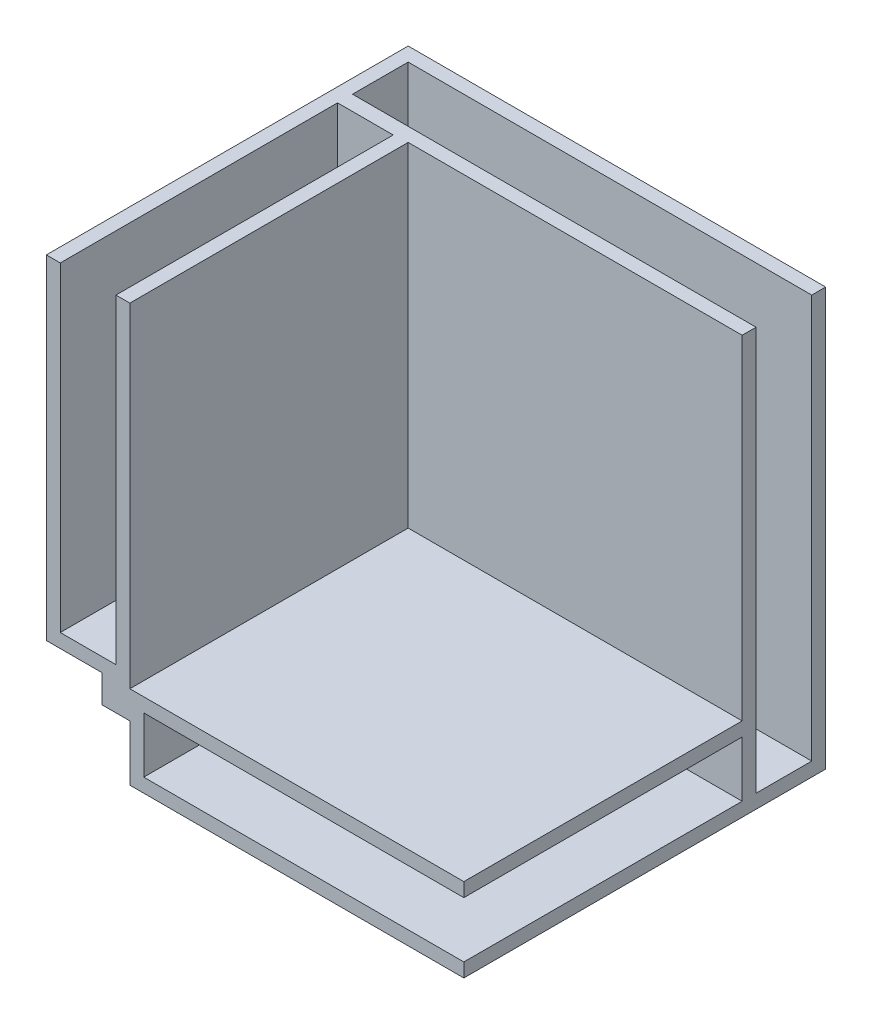
ISO-10303-21;
HEADER;
FILE_DESCRIPTION(('STEP AP214'),'2;1');
FILE_NAME('part.step','',(''),(''),'','','');
FILE_SCHEMA(('AUTOMOTIVE_DESIGN { 1 0 10303 214 1 1 1 1 }'));
ENDSEC;
DATA;
#1=APPLICATION_CONTEXT('core data for automotive mechanical design processes');
#2=APPLICATION_PROTOCOL_DEFINITION('international standard','automotive_design',2000,#1);
#3=PRODUCT_CONTEXT('',#1,'mechanical');
#4=PRODUCT('Part','Part','',(#3));
#5=PRODUCT_RELATED_PRODUCT_CATEGORY('part','',(#4));
#6=PRODUCT_DEFINITION_FORMATION('','',#4);
#7=PRODUCT_DEFINITION_CONTEXT('part definition',#1,'design');
#8=PRODUCT_DEFINITION('design','',#6,#7);
#9=PRODUCT_DEFINITION_SHAPE('','',#8);
#10=(LENGTH_UNIT() NAMED_UNIT(*) SI_UNIT(.MILLI.,.METRE.));
#11=(NAMED_UNIT(*) PLANE_ANGLE_UNIT() SI_UNIT($,.RADIAN.));
#12=(NAMED_UNIT(*) SI_UNIT($,.STERADIAN.) SOLID_ANGLE_UNIT());
#13=UNCERTAINTY_MEASURE_WITH_UNIT(LENGTH_MEASURE(1.E-05),#10,'distance_accuracy_value','');
#14=(GEOMETRIC_REPRESENTATION_CONTEXT(3) GLOBAL_UNCERTAINTY_ASSIGNED_CONTEXT((#13)) GLOBAL_UNIT_ASSIGNED_CONTEXT((#10,
#11,#12)) REPRESENTATION_CONTEXT('',''));
#15=CARTESIAN_POINT('',(0.,0.,0.));
#16=DIRECTION('',(0.,0.,1.));
#17=DIRECTION('',(1.,0.,0.));
#18=AXIS2_PLACEMENT_3D('',#15,#16,#17);
#19=CARTESIAN_POINT('',(5.,0.,26.));
#20=DIRECTION('',(-1.,0.,0.));
#21=DIRECTION('',(0.,0.,1.));
#22=AXIS2_PLACEMENT_3D('',#19,#20,#21);
#23=PLANE('',#22);
#24=DIRECTION('',(0.,1.,0.));
#25=VECTOR('',#24,1.);
#26=CARTESIAN_POINT('',(5.,30.,6.07514362919426));
#27=LINE('',#26,#25);
#28=CARTESIAN_POINT('',(5.,7.,6.07514362919426));
#29=VERTEX_POINT('',#28);
#30=CARTESIAN_POINT('',(5.,30.,6.07514362919426));
#31=VERTEX_POINT('',#30);
#32=EDGE_CURVE('E237',#29,#31,#27,.T.);
#33=ORIENTED_EDGE('',*,*,#32,.F.);
#34=DIRECTION('',(0.,0.,-1.));
#35=VECTOR('',#34,1.);
#36=CARTESIAN_POINT('',(5.,7.,26.));
#37=LINE('',#36,#35);
#38=CARTESIAN_POINT('',(5.,7.,26.));
#39=VERTEX_POINT('',#38);
#40=EDGE_CURVE('E260',#39,#29,#37,.T.);
#41=ORIENTED_EDGE('',*,*,#40,.F.);
#42=DIRECTION('',(0.,1.,0.));
#43=VECTOR('',#42,1.);
#44=CARTESIAN_POINT('',(5.,7.,26.));
#45=LINE('',#44,#43);
#46=CARTESIAN_POINT('',(5.,30.,26.));
#47=VERTEX_POINT('',#46);
#48=EDGE_CURVE('E234',#39,#47,#45,.T.);
#49=ORIENTED_EDGE('',*,*,#48,.T.);
#50=DIRECTION('',(0.,0.,-1.));
#51=VECTOR('',#50,1.);
#52=CARTESIAN_POINT('',(5.,30.,6.));
#53=LINE('',#52,#51);
#54=EDGE_CURVE('E264',#47,#31,#53,.T.);
#55=ORIENTED_EDGE('',*,*,#54,.T.);
#56=EDGE_LOOP('',(#33,#41,#49,#55));
#57=FACE_BOUND('',#56,.T.);
#58=ADVANCED_FACE('F37',(#57),#23,.T.);
#59=CARTESIAN_POINT('',(0.,7.,26.));
#60=DIRECTION('',(0.,-1.,0.));
#61=DIRECTION('',(1.,0.,0.));
#62=AXIS2_PLACEMENT_3D('',#59,#60,#61);
#63=PLANE('',#62);
#64=DIRECTION('',(1.,0.,0.));
#65=VECTOR('',#64,1.);
#66=CARTESIAN_POINT('',(0.,7.,6.07514362919426));
#67=LINE('',#66,#65);
#68=CARTESIAN_POINT('',(1.,7.,6.07514362919426));
#69=VERTEX_POINT('',#68);
#70=EDGE_CURVE('E243',#69,#29,#67,.T.);
#71=ORIENTED_EDGE('',*,*,#70,.F.);
#72=DIRECTION('',(0.,0.,-1.));
#73=VECTOR('',#72,1.);
#74=CARTESIAN_POINT('',(1.,7.,6.));
#75=LINE('',#74,#73);
#76=CARTESIAN_POINT('',(1.,7.,26.));
#77=VERTEX_POINT('',#76);
#78=EDGE_CURVE('E262',#77,#69,#75,.T.);
#79=ORIENTED_EDGE('',*,*,#78,.F.);
#80=DIRECTION('',(1.,0.,0.));
#81=VECTOR('',#80,1.);
#82=CARTESIAN_POINT('',(1.,7.,26.));
#83=LINE('',#82,#81);
#84=EDGE_CURVE('E231',#77,#39,#83,.T.);
#85=ORIENTED_EDGE('',*,*,#84,.T.);
#86=ORIENTED_EDGE('',*,*,#40,.T.);
#87=EDGE_LOOP('',(#71,#79,#85,#86));
#88=FACE_BOUND('',#87,.T.);
#89=ADVANCED_FACE('F412',(#88),#63,.F.);
#90=CARTESIAN_POINT('',(1.,0.,6.));
#91=DIRECTION('',(1.,0.,0.));
#92=DIRECTION('',(0.,0.,-1.));
#93=AXIS2_PLACEMENT_3D('',#90,#91,#92);
#94=PLANE('',#93);
#95=DIRECTION('',(0.,0.,-1.));
#96=VECTOR('',#95,1.);
#97=CARTESIAN_POINT('',(1.,30.,6.));
#98=LINE('',#97,#96);
#99=CARTESIAN_POINT('',(1.,30.,5.));
#100=VERTEX_POINT('',#99);
#101=CARTESIAN_POINT('',(1.,30.,1.));
#102=VERTEX_POINT('',#101);
#103=EDGE_CURVE('E281',#100,#102,#98,.T.);
#104=ORIENTED_EDGE('',*,*,#103,.F.);
#105=DIRECTION('',(0.,-1.,0.));
#106=VECTOR('',#105,1.);
#107=CARTESIAN_POINT('',(1.,0.,5.));
#108=LINE('',#107,#106);
#109=CARTESIAN_POINT('',(1.,1.,5.));
#110=VERTEX_POINT('',#109);
#111=EDGE_CURVE('E253',#100,#110,#108,.T.);
#112=ORIENTED_EDGE('',*,*,#111,.T.);
#113=DIRECTION('',(0.,0.,-1.));
#114=VECTOR('',#113,1.);
#115=CARTESIAN_POINT('',(1.,1.,6.));
#116=LINE('',#115,#114);
#117=CARTESIAN_POINT('',(1.,1.,1.));
#118=VERTEX_POINT('',#117);
#119=EDGE_CURVE('E269',#110,#118,#116,.T.);
#120=ORIENTED_EDGE('',*,*,#119,.T.);
#121=DIRECTION('',(0.,-1.,0.));
#122=VECTOR('',#121,1.);
#123=CARTESIAN_POINT('',(1.,0.,1.));
#124=LINE('',#123,#122);
#125=EDGE_CURVE('E265',#102,#118,#124,.T.);
#126=ORIENTED_EDGE('',*,*,#125,.F.);
#127=EDGE_LOOP('',(#104,#112,#120,#126));
#128=FACE_BOUND('',#127,.T.);
#129=ADVANCED_FACE('F431',(#128),#94,.T.);
#130=DIRECTION('',(0.,1.,0.));
#131=VECTOR('',#130,1.);
#132=CARTESIAN_POINT('',(1.,0.,6.07514362919426));
#133=LINE('',#132,#131);
#134=CARTESIAN_POINT('',(1.,30.,6.07514362919426));
#135=VERTEX_POINT('',#134);
#136=EDGE_CURVE('E11',#69,#135,#133,.T.);
#137=ORIENTED_EDGE('',*,*,#136,.T.);
#138=CARTESIAN_POINT('',(1.,30.,26.));
#139=VERTEX_POINT('',#138);
#140=EDGE_CURVE('E278',#139,#135,#98,.T.);
#141=ORIENTED_EDGE('',*,*,#140,.F.);
#142=DIRECTION('',(0.,-1.,0.));
#143=VECTOR('',#142,1.);
#144=CARTESIAN_POINT('',(1.,7.,26.));
#145=LINE('',#144,#143);
#146=EDGE_CURVE('E226',#139,#77,#145,.T.);
#147=ORIENTED_EDGE('',*,*,#146,.T.);
#148=ORIENTED_EDGE('',*,*,#78,.T.);
#149=EDGE_LOOP('',(#137,#141,#147,#148));
#150=FACE_BOUND('',#149,.T.);
#151=ADVANCED_FACE('F415',(#150),#94,.T.);
#152=CARTESIAN_POINT('',(6.,5.,26.));
#153=DIRECTION('',(0.,-1.,0.));
#154=DIRECTION('',(0.,0.,-1.));
#155=AXIS2_PLACEMENT_3D('',#152,#153,#154);
#156=PLANE('',#155);
#157=DIRECTION('',(0.,0.,-1.));
#158=VECTOR('',#157,1.);
#159=CARTESIAN_POINT('',(7.,5.,26.));
#160=LINE('',#159,#158);
#161=CARTESIAN_POINT('',(7.,5.,26.));
#162=VERTEX_POINT('',#161);
#163=CARTESIAN_POINT('',(7.,5.,6.));
#164=VERTEX_POINT('',#163);
#165=EDGE_CURVE('E210',#162,#164,#160,.T.);
#166=ORIENTED_EDGE('',*,*,#165,.T.);
#167=DIRECTION('',(-1.,0.,0.));
#168=VECTOR('',#167,1.);
#169=CARTESIAN_POINT('',(30.,5.,6.));
#170=LINE('',#169,#168);
#171=CARTESIAN_POINT('',(30.,5.,6.));
#172=VERTEX_POINT('',#171);
#173=EDGE_CURVE('E246',#172,#164,#170,.T.);
#174=ORIENTED_EDGE('',*,*,#173,.F.);
#175=DIRECTION('',(0.,0.,-1.));
#176=VECTOR('',#175,1.);
#177=CARTESIAN_POINT('',(30.,5.,26.));
#178=LINE('',#177,#176);
#179=CARTESIAN_POINT('',(30.,5.,26.));
#180=VERTEX_POINT('',#179);
#181=EDGE_CURVE('E211',#180,#172,#178,.T.);
#182=ORIENTED_EDGE('',*,*,#181,.F.);
#183=DIRECTION('',(-1.,0.,0.));
#184=VECTOR('',#183,1.);
#185=CARTESIAN_POINT('',(7.,5.,26.));
#186=LINE('',#185,#184);
#187=EDGE_CURVE('E224',#180,#162,#186,.T.);
#188=ORIENTED_EDGE('',*,*,#187,.T.);
#189=EDGE_LOOP('',(#166,#174,#182,#188));
#190=FACE_BOUND('',#189,.T.);
#191=ADVANCED_FACE('F385',(#190),#156,.T.);
#192=CARTESIAN_POINT('',(0.,1.,6.));
#193=DIRECTION('',(0.,1.,0.));
#194=DIRECTION('',(0.,0.,1.));
#195=AXIS2_PLACEMENT_3D('',#192,#193,#194);
#196=PLANE('',#195);
#197=DIRECTION('',(0.,0.,-1.));
#198=VECTOR('',#197,1.);
#199=CARTESIAN_POINT('',(30.,1.,6.));
#200=LINE('',#199,#198);
#201=CARTESIAN_POINT('',(30.,1.,26.));
#202=VERTEX_POINT('',#201);
#203=CARTESIAN_POINT('',(30.,1.,6.));
#204=VERTEX_POINT('',#203);
#205=EDGE_CURVE('E273',#202,#204,#200,.T.);
#206=ORIENTED_EDGE('',*,*,#205,.T.);
#207=DIRECTION('',(-1.,0.,0.));
#208=VECTOR('',#207,1.);
#209=CARTESIAN_POINT('',(0.,1.,6.));
#210=LINE('',#209,#208);
#211=CARTESIAN_POINT('',(7.,1.,6.));
#212=VERTEX_POINT('',#211);
#213=EDGE_CURVE('E206',#204,#212,#210,.T.);
#214=ORIENTED_EDGE('',*,*,#213,.T.);
#215=DIRECTION('',(0.,0.,-1.));
#216=VECTOR('',#215,1.);
#217=CARTESIAN_POINT('',(7.,1.,6.));
#218=LINE('',#217,#216);
#219=CARTESIAN_POINT('',(7.,1.,26.));
#220=VERTEX_POINT('',#219);
#221=EDGE_CURVE('E199',#220,#212,#218,.T.);
#222=ORIENTED_EDGE('',*,*,#221,.F.);
#223=DIRECTION('',(1.,0.,0.));
#224=VECTOR('',#223,1.);
#225=CARTESIAN_POINT('',(7.,1.,26.));
#226=LINE('',#225,#224);
#227=EDGE_CURVE('E203',#220,#202,#226,.T.);
#228=ORIENTED_EDGE('',*,*,#227,.T.);
#229=EDGE_LOOP('',(#206,#214,#222,#228));
#230=FACE_BOUND('',#229,.T.);
#231=ADVANCED_FACE('F201',(#230),#196,.T.);
#232=DIRECTION('',(1.,0.,0.));
#233=VECTOR('',#232,1.);
#234=CARTESIAN_POINT('',(0.,1.,5.));
#235=LINE('',#234,#233);
#236=CARTESIAN_POINT('',(30.,1.,5.));
#237=VERTEX_POINT('',#236);
#238=EDGE_CURVE('E255',#110,#237,#235,.T.);
#239=ORIENTED_EDGE('',*,*,#238,.T.);
#240=CARTESIAN_POINT('',(30.,1.,1.));
#241=VERTEX_POINT('',#240);
#242=EDGE_CURVE('E280',#237,#241,#200,.T.);
#243=ORIENTED_EDGE('',*,*,#242,.T.);
#244=DIRECTION('',(1.,0.,0.));
#245=VECTOR('',#244,1.);
#246=CARTESIAN_POINT('',(0.,1.,1.));
#247=LINE('',#246,#245);
#248=EDGE_CURVE('E268',#118,#241,#247,.T.);
#249=ORIENTED_EDGE('',*,*,#248,.F.);
#250=ORIENTED_EDGE('',*,*,#119,.F.);
#251=EDGE_LOOP('',(#239,#243,#249,#250));
#252=FACE_BOUND('',#251,.T.);
#253=ADVANCED_FACE('F441',(#252),#196,.T.);
#254=CARTESIAN_POINT('',(7.,6.,26.));
#255=DIRECTION('',(1.,0.,0.));
#256=DIRECTION('',(0.,1.,0.));
#257=AXIS2_PLACEMENT_3D('',#254,#255,#256);
#258=PLANE('',#257);
#259=ORIENTED_EDGE('',*,*,#221,.T.);
#260=DIRECTION('',(0.,1.,0.));
#261=VECTOR('',#260,1.);
#262=CARTESIAN_POINT('',(7.,6.,6.));
#263=LINE('',#262,#261);
#264=EDGE_CURVE('E45',#212,#164,#263,.T.);
#265=ORIENTED_EDGE('',*,*,#264,.T.);
#266=ORIENTED_EDGE('',*,*,#165,.F.);
#267=DIRECTION('',(0.,-1.,0.));
#268=VECTOR('',#267,1.);
#269=CARTESIAN_POINT('',(7.,5.,26.));
#270=LINE('',#269,#268);
#271=EDGE_CURVE('E214',#162,#220,#270,.T.);
#272=ORIENTED_EDGE('',*,*,#271,.T.);
#273=EDGE_LOOP('',(#259,#265,#266,#272));
#274=FACE_BOUND('',#273,.T.);
#275=ADVANCED_FACE('F215',(#274),#258,.T.);
#276=CARTESIAN_POINT('',(30.,0.,6.));
#277=DIRECTION('',(-1.,0.,0.));
#278=DIRECTION('',(0.,0.,1.));
#279=AXIS2_PLACEMENT_3D('',#276,#277,#278);
#280=PLANE('',#279);
#281=DIRECTION('',(0.,1.,0.));
#282=VECTOR('',#281,1.);
#283=CARTESIAN_POINT('',(30.,6.,26.));
#284=LINE('',#283,#282);
#285=CARTESIAN_POINT('',(30.,6.,26.));
#286=VERTEX_POINT('',#285);
#287=EDGE_CURVE('E296',#180,#286,#284,.T.);
#288=ORIENTED_EDGE('',*,*,#287,.F.);
#289=ORIENTED_EDGE('',*,*,#181,.T.);
#290=DIRECTION('',(0.,1.,0.));
#291=VECTOR('',#290,1.);
#292=CARTESIAN_POINT('',(30.,0.,6.));
#293=LINE('',#292,#291);
#294=EDGE_CURVE('E249',#204,#172,#293,.T.);
#295=ORIENTED_EDGE('',*,*,#294,.F.);
#296=ORIENTED_EDGE('',*,*,#205,.F.);
#297=CARTESIAN_POINT('',(30.,0.,26.));
#298=VERTEX_POINT('',#297);
#299=EDGE_CURVE('E223',#298,#202,#284,.T.);
#300=ORIENTED_EDGE('',*,*,#299,.F.);
#301=DIRECTION('',(0.,0.,-1.));
#302=VECTOR('',#301,1.);
#303=CARTESIAN_POINT('',(30.,0.,6.));
#304=LINE('',#303,#302);
#305=CARTESIAN_POINT('',(30.,0.,0.));
#306=VERTEX_POINT('',#305);
#307=EDGE_CURVE('E376',#298,#306,#304,.T.);
#308=ORIENTED_EDGE('',*,*,#307,.T.);
#309=DIRECTION('',(0.,1.,0.));
#310=VECTOR('',#309,1.);
#311=CARTESIAN_POINT('',(30.,0.,0.));
#312=LINE('',#311,#310);
#313=CARTESIAN_POINT('',(30.,30.,0.));
#314=VERTEX_POINT('',#313);
#315=EDGE_CURVE('E367',#306,#314,#312,.T.);
#316=ORIENTED_EDGE('',*,*,#315,.T.);
#317=DIRECTION('',(0.,0.,-1.));
#318=VECTOR('',#317,1.);
#319=CARTESIAN_POINT('',(30.,30.,6.));
#320=LINE('',#319,#318);
#321=CARTESIAN_POINT('',(30.,30.,1.));
#322=VERTEX_POINT('',#321);
#323=EDGE_CURVE('E373',#322,#314,#320,.T.);
#324=ORIENTED_EDGE('',*,*,#323,.F.);
#325=DIRECTION('',(0.,1.,0.));
#326=VECTOR('',#325,1.);
#327=CARTESIAN_POINT('',(30.,0.,1.));
#328=LINE('',#327,#326);
#329=EDGE_CURVE('E275',#241,#322,#328,.T.);
#330=ORIENTED_EDGE('',*,*,#329,.F.);
#331=ORIENTED_EDGE('',*,*,#242,.F.);
#332=DIRECTION('',(0.,1.,0.));
#333=VECTOR('',#332,1.);
#334=CARTESIAN_POINT('',(30.,0.,5.));
#335=LINE('',#334,#333);
#336=CARTESIAN_POINT('',(30.,30.,5.));
#337=VERTEX_POINT('',#336);
#338=EDGE_CURVE('E259',#237,#337,#335,.T.);
#339=ORIENTED_EDGE('',*,*,#338,.T.);
#340=CARTESIAN_POINT('',(30.,30.,6.));
#341=VERTEX_POINT('',#340);
#342=EDGE_CURVE('E374',#341,#337,#320,.T.);
#343=ORIENTED_EDGE('',*,*,#342,.F.);
#344=DIRECTION('',(0.,1.,0.));
#345=VECTOR('',#344,1.);
#346=CARTESIAN_POINT('',(30.,0.,6.));
#347=LINE('',#346,#345);
#348=CARTESIAN_POINT('',(30.,6.,6.));
#349=VERTEX_POINT('',#348);
#350=EDGE_CURVE('E356',#349,#341,#347,.T.);
#351=ORIENTED_EDGE('',*,*,#350,.F.);
#352=DIRECTION('',(0.,0.,-1.));
#353=VECTOR('',#352,1.);
#354=CARTESIAN_POINT('',(30.,6.,26.));
#355=LINE('',#354,#353);
#356=EDGE_CURVE('E306',#286,#349,#355,.T.);
#357=ORIENTED_EDGE('',*,*,#356,.F.);
#358=EDGE_LOOP('',(#288,#289,#295,#296,#300,#308,#316,#324,#330,#331,#339,#343,#351,#357));
#359=FACE_BOUND('',#358,.T.);
#360=ADVANCED_FACE('F389',(#359),#280,.F.);
#361=CARTESIAN_POINT('',(0.,30.,6.));
#362=DIRECTION('',(0.,-1.,0.));
#363=DIRECTION('',(0.,0.,-1.));
#364=AXIS2_PLACEMENT_3D('',#361,#362,#363);
#365=PLANE('',#364);
#366=DIRECTION('',(-1.,0.,0.));
#367=VECTOR('',#366,1.);
#368=CARTESIAN_POINT('',(0.,30.,26.));
#369=LINE('',#368,#367);
#370=CARTESIAN_POINT('',(0.,30.,26.));
#371=VERTEX_POINT('',#370);
#372=EDGE_CURVE('E336',#139,#371,#369,.T.);
#373=ORIENTED_EDGE('',*,*,#372,.F.);
#374=ORIENTED_EDGE('',*,*,#140,.T.);
#375=DIRECTION('',(1.,0.,0.));
#376=VECTOR('',#375,1.);
#377=CARTESIAN_POINT('',(0.,30.,6.07514362919426));
#378=LINE('',#377,#376);
#379=EDGE_CURVE('E240',#135,#31,#378,.T.);
#380=ORIENTED_EDGE('',*,*,#379,.T.);
#381=ORIENTED_EDGE('',*,*,#54,.F.);
#382=CARTESIAN_POINT('',(6.,30.,26.));
#383=VERTEX_POINT('',#382);
#384=EDGE_CURVE('E337',#383,#47,#369,.T.);
#385=ORIENTED_EDGE('',*,*,#384,.F.);
#386=DIRECTION('',(0.,0.,-1.));
#387=VECTOR('',#386,1.);
#388=CARTESIAN_POINT('',(6.,30.,26.));
#389=LINE('',#388,#387);
#390=CARTESIAN_POINT('',(6.,30.,6.));
#391=VERTEX_POINT('',#390);
#392=EDGE_CURVE('E348',#383,#391,#389,.T.);
#393=ORIENTED_EDGE('',*,*,#392,.T.);
#394=DIRECTION('',(-1.,0.,0.));
#395=VECTOR('',#394,1.);
#396=CARTESIAN_POINT('',(0.,30.,6.));
#397=LINE('',#396,#395);
#398=EDGE_CURVE('E358',#341,#391,#397,.T.);
#399=ORIENTED_EDGE('',*,*,#398,.F.);
#400=ORIENTED_EDGE('',*,*,#342,.T.);
#401=DIRECTION('',(-1.,0.,0.));
#402=VECTOR('',#401,1.);
#403=CARTESIAN_POINT('',(0.,30.,5.));
#404=LINE('',#403,#402);
#405=EDGE_CURVE('E52',#337,#100,#404,.T.);
#406=ORIENTED_EDGE('',*,*,#405,.T.);
#407=ORIENTED_EDGE('',*,*,#103,.T.);
#408=DIRECTION('',(-1.,0.,0.));
#409=VECTOR('',#408,1.);
#410=CARTESIAN_POINT('',(0.,30.,1.));
#411=LINE('',#410,#409);
#412=EDGE_CURVE('E256',#322,#102,#411,.T.);
#413=ORIENTED_EDGE('',*,*,#412,.F.);
#414=ORIENTED_EDGE('',*,*,#323,.T.);
#415=DIRECTION('',(-1.,0.,0.));
#416=VECTOR('',#415,1.);
#417=CARTESIAN_POINT('',(0.,30.,0.));
#418=LINE('',#417,#416);
#419=CARTESIAN_POINT('',(0.,30.,0.));
#420=VERTEX_POINT('',#419);
#421=EDGE_CURVE('E354',#314,#420,#418,.T.);
#422=ORIENTED_EDGE('',*,*,#421,.T.);
#423=DIRECTION('',(0.,0.,-1.));
#424=VECTOR('',#423,1.);
#425=CARTESIAN_POINT('',(0.,30.,6.));
#426=LINE('',#425,#424);
#427=EDGE_CURVE('E361',#371,#420,#426,.T.);
#428=ORIENTED_EDGE('',*,*,#427,.F.);
#429=EDGE_LOOP('',(#373,#374,#380,#381,#385,#393,#399,#400,#406,#407,#413,#414,#422,#428));
#430=FACE_BOUND('',#429,.T.);
#431=ADVANCED_FACE('F404',(#430),#365,.F.);
#432=CARTESIAN_POINT('',(0.,0.,6.));
#433=DIRECTION('',(0.,0.,-1.));
#434=DIRECTION('',(-1.,0.,0.));
#435=AXIS2_PLACEMENT_3D('',#432,#433,#434);
#436=PLANE('',#435);
#437=DIRECTION('',(0.,-1.,0.));
#438=VECTOR('',#437,1.);
#439=CARTESIAN_POINT('',(6.,6.,6.));
#440=LINE('',#439,#438);
#441=CARTESIAN_POINT('',(6.,4.,6.));
#442=VERTEX_POINT('',#441);
#443=CARTESIAN_POINT('',(6.,0.,6.));
#444=VERTEX_POINT('',#443);
#445=EDGE_CURVE('E272',#442,#444,#440,.T.);
#446=ORIENTED_EDGE('',*,*,#445,.F.);
#447=DIRECTION('',(1.,0.,0.));
#448=VECTOR('',#447,1.);
#449=CARTESIAN_POINT('',(6.,4.,6.));
#450=LINE('',#449,#448);
#451=CARTESIAN_POINT('',(4.,4.,6.));
#452=VERTEX_POINT('',#451);
#453=EDGE_CURVE('E316',#452,#442,#450,.T.);
#454=ORIENTED_EDGE('',*,*,#453,.F.);
#455=DIRECTION('',(0.,-1.,0.));
#456=VECTOR('',#455,1.);
#457=CARTESIAN_POINT('',(4.,6.,6.));
#458=LINE('',#457,#456);
#459=CARTESIAN_POINT('',(4.,6.,6.));
#460=VERTEX_POINT('',#459);
#461=EDGE_CURVE('E312',#460,#452,#458,.T.);
#462=ORIENTED_EDGE('',*,*,#461,.F.);
#463=DIRECTION('',(-1.,0.,0.));
#464=VECTOR('',#463,1.);
#465=CARTESIAN_POINT('',(0.,6.,6.));
#466=LINE('',#465,#464);
#467=CARTESIAN_POINT('',(0.,6.,6.));
#468=VERTEX_POINT('',#467);
#469=EDGE_CURVE('E330',#460,#468,#466,.T.);
#470=ORIENTED_EDGE('',*,*,#469,.T.);
#471=DIRECTION('',(0.,-1.,0.));
#472=VECTOR('',#471,1.);
#473=CARTESIAN_POINT('',(0.,0.,6.));
#474=LINE('',#473,#472);
#475=CARTESIAN_POINT('',(0.,0.,6.));
#476=VERTEX_POINT('',#475);
#477=EDGE_CURVE('E352',#468,#476,#474,.T.);
#478=ORIENTED_EDGE('',*,*,#477,.T.);
#479=DIRECTION('',(1.,0.,0.));
#480=VECTOR('',#479,1.);
#481=CARTESIAN_POINT('',(0.,0.,6.));
#482=LINE('',#481,#480);
#483=EDGE_CURVE('E60',#476,#444,#482,.T.);
#484=ORIENTED_EDGE('',*,*,#483,.T.);
#485=EDGE_LOOP('',(#446,#454,#462,#470,#478,#484));
#486=FACE_BOUND('',#485,.T.);
#487=ADVANCED_FACE('F473',(#486),#436,.F.);
#488=DIRECTION('',(-1.,0.,0.));
#489=VECTOR('',#488,1.);
#490=CARTESIAN_POINT('',(6.,6.,6.));
#491=LINE('',#490,#489);
#492=CARTESIAN_POINT('',(6.,6.,6.));
#493=VERTEX_POINT('',#492);
#494=EDGE_CURVE('E294',#349,#493,#491,.T.);
#495=ORIENTED_EDGE('',*,*,#494,.F.);
#496=ORIENTED_EDGE('',*,*,#350,.T.);
#497=ORIENTED_EDGE('',*,*,#398,.T.);
#498=DIRECTION('',(0.,1.,0.));
#499=VECTOR('',#498,1.);
#500=CARTESIAN_POINT('',(6.,0.,6.));
#501=LINE('',#500,#499);
#502=EDGE_CURVE('E334',#493,#391,#501,.T.);
#503=ORIENTED_EDGE('',*,*,#502,.F.);
#504=EDGE_LOOP('',(#495,#496,#497,#503));
#505=FACE_BOUND('',#504,.T.);
#506=ADVANCED_FACE('F469',(#505),#436,.F.);
#507=CARTESIAN_POINT('',(6.,0.,26.));
#508=DIRECTION('',(-1.,0.,0.));
#509=DIRECTION('',(0.,0.,1.));
#510=AXIS2_PLACEMENT_3D('',#507,#508,#509);
#511=PLANE('',#510);
#512=DIRECTION('',(0.,0.,-1.));
#513=VECTOR('',#512,1.);
#514=CARTESIAN_POINT('',(6.,6.,26.));
#515=LINE('',#514,#513);
#516=CARTESIAN_POINT('',(6.,6.,26.));
#517=VERTEX_POINT('',#516);
#518=EDGE_CURVE('E301',#517,#493,#515,.T.);
#519=ORIENTED_EDGE('',*,*,#518,.T.);
#520=ORIENTED_EDGE('',*,*,#502,.T.);
#521=ORIENTED_EDGE('',*,*,#392,.F.);
#522=DIRECTION('',(0.,1.,0.));
#523=VECTOR('',#522,1.);
#524=CARTESIAN_POINT('',(6.,0.,26.));
#525=LINE('',#524,#523);
#526=EDGE_CURVE('E333',#517,#383,#525,.T.);
#527=ORIENTED_EDGE('',*,*,#526,.F.);
#528=EDGE_LOOP('',(#519,#520,#521,#527));
#529=FACE_BOUND('',#528,.T.);
#530=ADVANCED_FACE('F400',(#529),#511,.F.);
#531=CARTESIAN_POINT('',(0.,6.,26.));
#532=DIRECTION('',(0.,-1.,0.));
#533=DIRECTION('',(1.,0.,0.));
#534=AXIS2_PLACEMENT_3D('',#531,#532,#533);
#535=PLANE('',#534);
#536=ORIENTED_EDGE('',*,*,#469,.F.);
#537=DIRECTION('',(0.,0.,-1.));
#538=VECTOR('',#537,1.);
#539=CARTESIAN_POINT('',(4.,6.,26.));
#540=LINE('',#539,#538);
#541=CARTESIAN_POINT('',(4.,6.,26.));
#542=VERTEX_POINT('',#541);
#543=EDGE_CURVE('E327',#542,#460,#540,.T.);
#544=ORIENTED_EDGE('',*,*,#543,.F.);
#545=DIRECTION('',(-1.,0.,0.));
#546=VECTOR('',#545,1.);
#547=CARTESIAN_POINT('',(0.,6.,26.));
#548=LINE('',#547,#546);
#549=CARTESIAN_POINT('',(0.,6.,26.));
#550=VERTEX_POINT('',#549);
#551=EDGE_CURVE('E331',#542,#550,#548,.T.);
#552=ORIENTED_EDGE('',*,*,#551,.T.);
#553=DIRECTION('',(0.,0.,-1.));
#554=VECTOR('',#553,1.);
#555=CARTESIAN_POINT('',(0.,6.,26.));
#556=LINE('',#555,#554);
#557=EDGE_CURVE('E343',#550,#468,#556,.T.);
#558=ORIENTED_EDGE('',*,*,#557,.T.);
#559=EDGE_LOOP('',(#536,#544,#552,#558));
#560=FACE_BOUND('',#559,.T.);
#561=ADVANCED_FACE('F468',(#560),#535,.T.);
#562=CARTESIAN_POINT('',(0.,0.,6.));
#563=DIRECTION('',(1.,0.,0.));
#564=DIRECTION('',(0.,0.,-1.));
#565=AXIS2_PLACEMENT_3D('',#562,#563,#564);
#566=PLANE('',#565);
#567=ORIENTED_EDGE('',*,*,#427,.T.);
#568=DIRECTION('',(0.,-1.,0.));
#569=VECTOR('',#568,1.);
#570=CARTESIAN_POINT('',(0.,0.,0.));
#571=LINE('',#570,#569);
#572=CARTESIAN_POINT('',(0.,0.,0.));
#573=VERTEX_POINT('',#572);
#574=EDGE_CURVE('E351',#420,#573,#571,.T.);
#575=ORIENTED_EDGE('',*,*,#574,.T.);
#576=DIRECTION('',(0.,0.,-1.));
#577=VECTOR('',#576,1.);
#578=CARTESIAN_POINT('',(0.,0.,6.));
#579=LINE('',#578,#577);
#580=EDGE_CURVE('E378',#476,#573,#579,.T.);
#581=ORIENTED_EDGE('',*,*,#580,.F.);
#582=ORIENTED_EDGE('',*,*,#477,.F.);
#583=ORIENTED_EDGE('',*,*,#557,.F.);
#584=DIRECTION('',(0.,-1.,0.));
#585=VECTOR('',#584,1.);
#586=CARTESIAN_POINT('',(0.,0.,26.));
#587=LINE('',#586,#585);
#588=EDGE_CURVE('E340',#371,#550,#587,.T.);
#589=ORIENTED_EDGE('',*,*,#588,.F.);
#590=EDGE_LOOP('',(#567,#575,#581,#582,#583,#589));
#591=FACE_BOUND('',#590,.T.);
#592=ADVANCED_FACE('F39',(#591),#566,.F.);
#593=CARTESIAN_POINT('',(0.,0.,6.));
#594=DIRECTION('',(0.,1.,0.));
#595=DIRECTION('',(0.,0.,1.));
#596=AXIS2_PLACEMENT_3D('',#593,#594,#595);
#597=PLANE('',#596);
#598=DIRECTION('',(1.,0.,0.));
#599=VECTOR('',#598,1.);
#600=CARTESIAN_POINT('',(0.,0.,0.));
#601=LINE('',#600,#599);
#602=EDGE_CURVE('E364',#573,#306,#601,.T.);
#603=ORIENTED_EDGE('',*,*,#602,.T.);
#604=ORIENTED_EDGE('',*,*,#307,.F.);
#605=DIRECTION('',(1.,0.,0.));
#606=VECTOR('',#605,1.);
#607=CARTESIAN_POINT('',(6.,0.,26.));
#608=LINE('',#607,#606);
#609=CARTESIAN_POINT('',(6.,0.,26.));
#610=VERTEX_POINT('',#609);
#611=EDGE_CURVE('E293',#610,#298,#608,.T.);
#612=ORIENTED_EDGE('',*,*,#611,.F.);
#613=DIRECTION('',(0.,0.,-1.));
#614=VECTOR('',#613,1.);
#615=CARTESIAN_POINT('',(6.,0.,26.));
#616=LINE('',#615,#614);
#617=EDGE_CURVE('E309',#610,#444,#616,.T.);
#618=ORIENTED_EDGE('',*,*,#617,.T.);
#619=ORIENTED_EDGE('',*,*,#483,.F.);
#620=ORIENTED_EDGE('',*,*,#580,.T.);
#621=EDGE_LOOP('',(#603,#604,#612,#618,#619,#620));
#622=FACE_BOUND('',#621,.T.);
#623=ADVANCED_FACE('F478',(#622),#597,.F.);
#624=CARTESIAN_POINT('',(0.,0.,0.));
#625=DIRECTION('',(0.,0.,-1.));
#626=DIRECTION('',(-1.,0.,0.));
#627=AXIS2_PLACEMENT_3D('',#624,#625,#626);
#628=PLANE('',#627);
#629=ORIENTED_EDGE('',*,*,#574,.F.);
#630=ORIENTED_EDGE('',*,*,#421,.F.);
#631=ORIENTED_EDGE('',*,*,#315,.F.);
#632=ORIENTED_EDGE('',*,*,#602,.F.);
#633=EDGE_LOOP('',(#629,#630,#631,#632));
#634=FACE_BOUND('',#633,.T.);
#635=ADVANCED_FACE('F465',(#634),#628,.T.);
#636=CARTESIAN_POINT('',(0.,0.,26.));
#637=DIRECTION('',(0.,0.,1.));
#638=DIRECTION('',(1.,0.,0.));
#639=AXIS2_PLACEMENT_3D('',#636,#637,#638);
#640=PLANE('',#639);
#641=ORIENTED_EDGE('',*,*,#187,.F.);
#642=ORIENTED_EDGE('',*,*,#287,.T.);
#643=DIRECTION('',(-1.,0.,0.));
#644=VECTOR('',#643,1.);
#645=CARTESIAN_POINT('',(6.,6.,26.));
#646=LINE('',#645,#644);
#647=EDGE_CURVE('E298',#286,#517,#646,.T.);
#648=ORIENTED_EDGE('',*,*,#647,.T.);
#649=ORIENTED_EDGE('',*,*,#526,.T.);
#650=ORIENTED_EDGE('',*,*,#384,.T.);
#651=ORIENTED_EDGE('',*,*,#48,.F.);
#652=ORIENTED_EDGE('',*,*,#84,.F.);
#653=ORIENTED_EDGE('',*,*,#146,.F.);
#654=ORIENTED_EDGE('',*,*,#372,.T.);
#655=ORIENTED_EDGE('',*,*,#588,.T.);
#656=ORIENTED_EDGE('',*,*,#551,.F.);
#657=DIRECTION('',(0.,-1.,0.));
#658=VECTOR('',#657,1.);
#659=CARTESIAN_POINT('',(4.,6.,26.));
#660=LINE('',#659,#658);
#661=CARTESIAN_POINT('',(4.,4.,26.));
#662=VERTEX_POINT('',#661);
#663=EDGE_CURVE('E313',#542,#662,#660,.T.);
#664=ORIENTED_EDGE('',*,*,#663,.T.);
#665=DIRECTION('',(1.,0.,0.));
#666=VECTOR('',#665,1.);
#667=CARTESIAN_POINT('',(6.,4.,26.));
#668=LINE('',#667,#666);
#669=CARTESIAN_POINT('',(6.,4.,26.));
#670=VERTEX_POINT('',#669);
#671=EDGE_CURVE('E315',#662,#670,#668,.T.);
#672=ORIENTED_EDGE('',*,*,#671,.T.);
#673=DIRECTION('',(0.,-1.,0.));
#674=VECTOR('',#673,1.);
#675=CARTESIAN_POINT('',(6.,6.,26.));
#676=LINE('',#675,#674);
#677=EDGE_CURVE('E291',#670,#610,#676,.T.);
#678=ORIENTED_EDGE('',*,*,#677,.T.);
#679=ORIENTED_EDGE('',*,*,#611,.T.);
#680=ORIENTED_EDGE('',*,*,#299,.T.);
#681=ORIENTED_EDGE('',*,*,#227,.F.);
#682=ORIENTED_EDGE('',*,*,#271,.F.);
#683=EDGE_LOOP('',(#641,#642,#648,#649,#650,#651,#652,#653,#654,#655,#656,#664,#672,#678,#679,
#680,#681,#682));
#684=FACE_BOUND('',#683,.T.);
#685=ADVANCED_FACE('F220',(#684),#640,.T.);
#686=CARTESIAN_POINT('',(4.,6.,26.));
#687=DIRECTION('',(1.,0.,0.));
#688=DIRECTION('',(0.,0.,-1.));
#689=AXIS2_PLACEMENT_3D('',#686,#687,#688);
#690=PLANE('',#689);
#691=ORIENTED_EDGE('',*,*,#461,.T.);
#692=DIRECTION('',(0.,0.,-1.));
#693=VECTOR('',#692,1.);
#694=CARTESIAN_POINT('',(4.,4.,26.));
#695=LINE('',#694,#693);
#696=EDGE_CURVE('E324',#662,#452,#695,.T.);
#697=ORIENTED_EDGE('',*,*,#696,.F.);
#698=ORIENTED_EDGE('',*,*,#663,.F.);
#699=ORIENTED_EDGE('',*,*,#543,.T.);
#700=EDGE_LOOP('',(#691,#697,#698,#699));
#701=FACE_BOUND('',#700,.T.);
#702=ADVANCED_FACE('F458',(#701),#690,.F.);
#703=CARTESIAN_POINT('',(6.,4.,26.));
#704=DIRECTION('',(0.,1.,0.));
#705=DIRECTION('',(0.,0.,1.));
#706=AXIS2_PLACEMENT_3D('',#703,#704,#705);
#707=PLANE('',#706);
#708=ORIENTED_EDGE('',*,*,#453,.T.);
#709=DIRECTION('',(0.,0.,-1.));
#710=VECTOR('',#709,1.);
#711=CARTESIAN_POINT('',(6.,4.,26.));
#712=LINE('',#711,#710);
#713=EDGE_CURVE('E318',#670,#442,#712,.T.);
#714=ORIENTED_EDGE('',*,*,#713,.F.);
#715=ORIENTED_EDGE('',*,*,#671,.F.);
#716=ORIENTED_EDGE('',*,*,#696,.T.);
#717=EDGE_LOOP('',(#708,#714,#715,#716));
#718=FACE_BOUND('',#717,.T.);
#719=ADVANCED_FACE('F454',(#718),#707,.F.);
#720=CARTESIAN_POINT('',(6.,6.,26.));
#721=DIRECTION('',(1.,0.,0.));
#722=DIRECTION('',(0.,1.,0.));
#723=AXIS2_PLACEMENT_3D('',#720,#721,#722);
#724=PLANE('',#723);
#725=ORIENTED_EDGE('',*,*,#677,.F.);
#726=ORIENTED_EDGE('',*,*,#713,.T.);
#727=ORIENTED_EDGE('',*,*,#445,.T.);
#728=ORIENTED_EDGE('',*,*,#617,.F.);
#729=EDGE_LOOP('',(#725,#726,#727,#728));
#730=FACE_BOUND('',#729,.T.);
#731=ADVANCED_FACE('F451',(#730),#724,.F.);
#732=CARTESIAN_POINT('',(6.,6.,26.));
#733=DIRECTION('',(0.,-1.,0.));
#734=DIRECTION('',(0.,0.,-1.));
#735=AXIS2_PLACEMENT_3D('',#732,#733,#734);
#736=PLANE('',#735);
#737=ORIENTED_EDGE('',*,*,#494,.T.);
#738=ORIENTED_EDGE('',*,*,#518,.F.);
#739=ORIENTED_EDGE('',*,*,#647,.F.);
#740=ORIENTED_EDGE('',*,*,#356,.T.);
#741=EDGE_LOOP('',(#737,#738,#739,#740));
#742=FACE_BOUND('',#741,.T.);
#743=ADVANCED_FACE('F395',(#742),#736,.F.);
#744=CARTESIAN_POINT('',(0.,0.,5.));
#745=DIRECTION('',(0.,0.,-1.));
#746=DIRECTION('',(-1.,0.,0.));
#747=AXIS2_PLACEMENT_3D('',#744,#745,#746);
#748=PLANE('',#747);
#749=ORIENTED_EDGE('',*,*,#111,.F.);
#750=ORIENTED_EDGE('',*,*,#405,.F.);
#751=ORIENTED_EDGE('',*,*,#338,.F.);
#752=ORIENTED_EDGE('',*,*,#238,.F.);
#753=EDGE_LOOP('',(#749,#750,#751,#752));
#754=FACE_BOUND('',#753,.T.);
#755=ADVANCED_FACE('F434',(#754),#748,.T.);
#756=CARTESIAN_POINT('',(0.,0.,1.));
#757=DIRECTION('',(0.,0.,-1.));
#758=DIRECTION('',(-1.,0.,0.));
#759=AXIS2_PLACEMENT_3D('',#756,#757,#758);
#760=PLANE('',#759);
#761=ORIENTED_EDGE('',*,*,#125,.T.);
#762=ORIENTED_EDGE('',*,*,#248,.T.);
#763=ORIENTED_EDGE('',*,*,#329,.T.);
#764=ORIENTED_EDGE('',*,*,#412,.T.);
#765=EDGE_LOOP('',(#761,#762,#763,#764));
#766=FACE_BOUND('',#765,.T.);
#767=ADVANCED_FACE('F424',(#766),#760,.F.);
#768=CARTESIAN_POINT('',(30.,0.,6.));
#769=DIRECTION('',(0.,0.,-1.));
#770=DIRECTION('',(-1.,0.,0.));
#771=AXIS2_PLACEMENT_3D('',#768,#769,#770);
#772=PLANE('',#771);
#773=ORIENTED_EDGE('',*,*,#213,.F.);
#774=ORIENTED_EDGE('',*,*,#294,.T.);
#775=ORIENTED_EDGE('',*,*,#173,.T.);
#776=ORIENTED_EDGE('',*,*,#264,.F.);
#777=EDGE_LOOP('',(#773,#774,#775,#776));
#778=FACE_BOUND('',#777,.T.);
#779=ADVANCED_FACE('F381',(#778),#772,.F.);
#780=CARTESIAN_POINT('',(0.,30.,6.07514362919426));
#781=DIRECTION('',(0.,0.,-1.));
#782=DIRECTION('',(0.,1.,0.));
#783=AXIS2_PLACEMENT_3D('',#780,#781,#782);
#784=PLANE('',#783);
#785=ORIENTED_EDGE('',*,*,#136,.F.);
#786=ORIENTED_EDGE('',*,*,#70,.T.);
#787=ORIENTED_EDGE('',*,*,#32,.T.);
#788=ORIENTED_EDGE('',*,*,#379,.F.);
#789=EDGE_LOOP('',(#785,#786,#787,#788));
#790=FACE_BOUND('',#789,.T.);
#791=ADVANCED_FACE('F418',(#790),#784,.F.);
#792=CLOSED_SHELL('',(#58,#89,#129,#151,#191,#231,#253,#275,#360,#431,#487,#506,#530,#561,#592,
#623,#635,#685,#702,#719,#731,#743,#755,#767,#779,#791));
#793=MANIFOLD_SOLID_BREP('B2',#792);
#794=ADVANCED_BREP_SHAPE_REPRESENTATION('',(#18,#793),#14);
#795=SHAPE_DEFINITION_REPRESENTATION(#9,#794);
ENDSEC;
END-ISO-10303-21;
